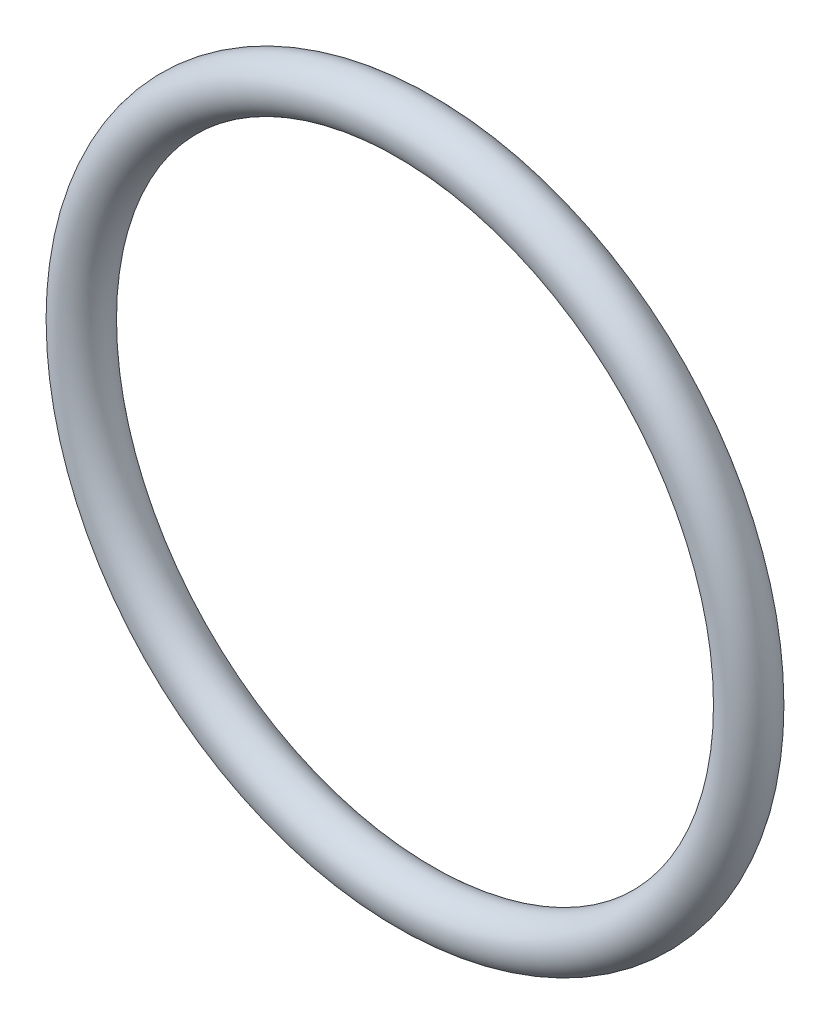
ISO-10303-21;
HEADER;
FILE_DESCRIPTION(('STEP AP214'),'2;1');
FILE_NAME('part.step','',(''),(''),'','','');
FILE_SCHEMA(('AUTOMOTIVE_DESIGN { 1 0 10303 214 1 1 1 1 }'));
ENDSEC;
DATA;
#1=APPLICATION_CONTEXT('core data for automotive mechanical design processes');
#2=APPLICATION_PROTOCOL_DEFINITION('international standard','automotive_design',2000,#1);
#3=PRODUCT_CONTEXT('',#1,'mechanical');
#4=PRODUCT('Part','Part','',(#3));
#5=PRODUCT_RELATED_PRODUCT_CATEGORY('part','',(#4));
#6=PRODUCT_DEFINITION_FORMATION('','',#4);
#7=PRODUCT_DEFINITION_CONTEXT('part definition',#1,'design');
#8=PRODUCT_DEFINITION('design','',#6,#7);
#9=PRODUCT_DEFINITION_SHAPE('','',#8);
#10=(LENGTH_UNIT() NAMED_UNIT(*) SI_UNIT(.MILLI.,.METRE.));
#11=(NAMED_UNIT(*) PLANE_ANGLE_UNIT() SI_UNIT($,.RADIAN.));
#12=(NAMED_UNIT(*) SI_UNIT($,.STERADIAN.) SOLID_ANGLE_UNIT());
#13=UNCERTAINTY_MEASURE_WITH_UNIT(LENGTH_MEASURE(1.E-05),#10,'distance_accuracy_value','');
#14=(GEOMETRIC_REPRESENTATION_CONTEXT(3) GLOBAL_UNCERTAINTY_ASSIGNED_CONTEXT((#13)) GLOBAL_UNIT_ASSIGNED_CONTEXT((#10,
#11,#12)) REPRESENTATION_CONTEXT('',''));
#15=CARTESIAN_POINT('',(0.,0.,0.));
#16=DIRECTION('',(0.,0.,1.));
#17=DIRECTION('',(1.,0.,0.));
#18=AXIS2_PLACEMENT_3D('',#15,#16,#17);
#19=CARTESIAN_POINT('',(0.,0.,0.));
#20=DIRECTION('',(0.,0.,1.));
#21=DIRECTION('',(1.,0.,0.));
#22=AXIS2_PLACEMENT_3D('',#19,#20,#21);
#23=TOROIDAL_SURFACE('',#22,11.90625,0.889000000000001);
#24=CARTESIAN_POINT('',(12.79525,0.,0.));
#25=VERTEX_POINT('',#24);
#26=VERTEX_LOOP('',#25);
#27=FACE_BOUND('',#26,.T.);
#28=ADVANCED_FACE('F39',(#27),#23,.T.);
#29=CLOSED_SHELL('',(#28));
#30=MANIFOLD_SOLID_BREP('B2',#29);
#31=ADVANCED_BREP_SHAPE_REPRESENTATION('',(#18,#30),#14);
#32=SHAPE_DEFINITION_REPRESENTATION(#9,#31);
ENDSEC;
END-ISO-10303-21;
